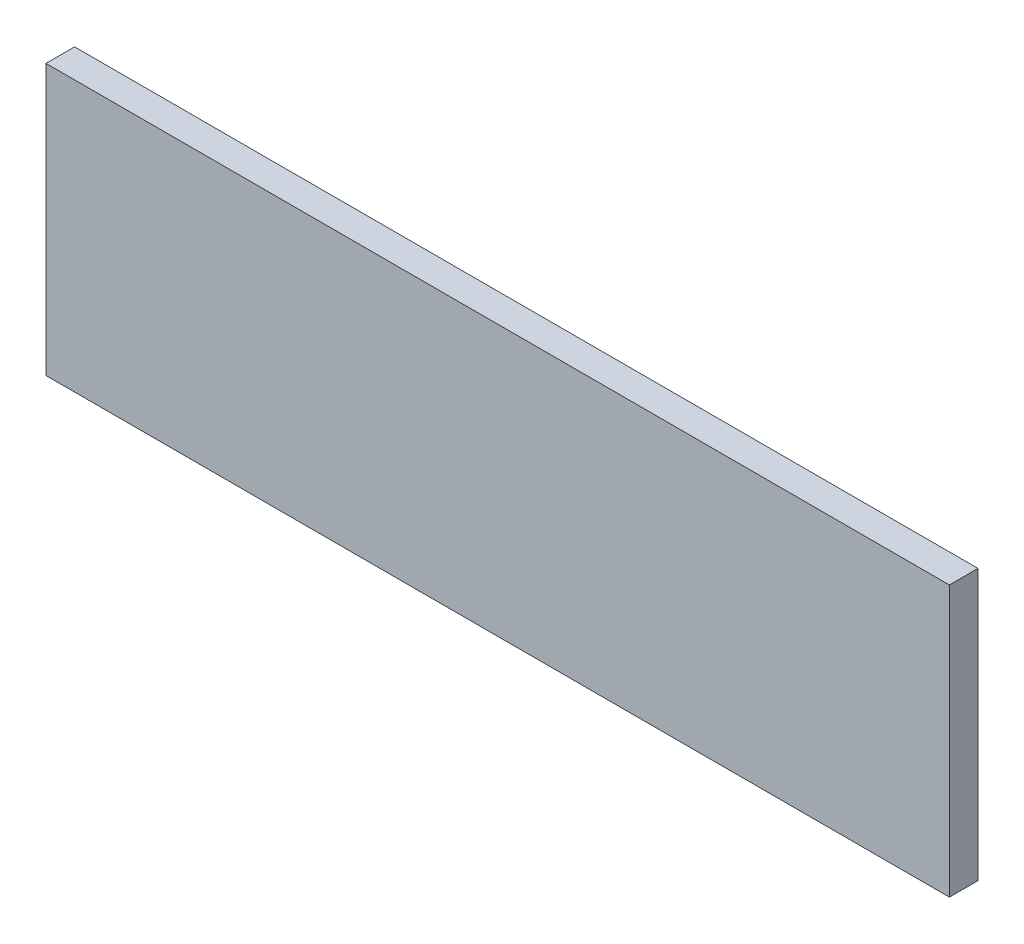
ISO-10303-21;
HEADER;
FILE_DESCRIPTION(('STEP AP214'),'2;1');
FILE_NAME('part.step','',(''),(''),'','','');
FILE_SCHEMA(('AUTOMOTIVE_DESIGN { 1 0 10303 214 1 1 1 1 }'));
ENDSEC;
DATA;
#1=APPLICATION_CONTEXT('core data for automotive mechanical design processes');
#2=APPLICATION_PROTOCOL_DEFINITION('international standard','automotive_design',2000,#1);
#3=PRODUCT_CONTEXT('',#1,'mechanical');
#4=PRODUCT('Part','Part','',(#3));
#5=PRODUCT_RELATED_PRODUCT_CATEGORY('part','',(#4));
#6=PRODUCT_DEFINITION_FORMATION('','',#4);
#7=PRODUCT_DEFINITION_CONTEXT('part definition',#1,'design');
#8=PRODUCT_DEFINITION('design','',#6,#7);
#9=PRODUCT_DEFINITION_SHAPE('','',#8);
#10=(LENGTH_UNIT() NAMED_UNIT(*) SI_UNIT(.MILLI.,.METRE.));
#11=(NAMED_UNIT(*) PLANE_ANGLE_UNIT() SI_UNIT($,.RADIAN.));
#12=(NAMED_UNIT(*) SI_UNIT($,.STERADIAN.) SOLID_ANGLE_UNIT());
#13=UNCERTAINTY_MEASURE_WITH_UNIT(LENGTH_MEASURE(1.E-05),#10,'distance_accuracy_value','');
#14=(GEOMETRIC_REPRESENTATION_CONTEXT(3) GLOBAL_UNCERTAINTY_ASSIGNED_CONTEXT((#13)) GLOBAL_UNIT_ASSIGNED_CONTEXT((#10,
#11,#12)) REPRESENTATION_CONTEXT('',''));
#15=CARTESIAN_POINT('',(0.,0.,0.));
#16=DIRECTION('',(0.,0.,1.));
#17=DIRECTION('',(1.,0.,0.));
#18=AXIS2_PLACEMENT_3D('',#15,#16,#17);
#19=CARTESIAN_POINT('',(50.1199999999999,15.,3.175));
#20=DIRECTION('',(-1.,0.,0.));
#21=DIRECTION('',(0.,-1.,0.));
#22=AXIS2_PLACEMENT_3D('',#19,#20,#21);
#23=PLANE('',#22);
#24=DIRECTION('',(0.,1.,0.));
#25=VECTOR('',#24,1.);
#26=CARTESIAN_POINT('',(50.1199999999999,15.,0.));
#27=LINE('',#26,#25);
#28=CARTESIAN_POINT('',(50.12,-15.,0.));
#29=VERTEX_POINT('',#28);
#30=CARTESIAN_POINT('',(50.1199999999999,15.,0.));
#31=VERTEX_POINT('',#30);
#32=EDGE_CURVE('E107',#29,#31,#27,.T.);
#33=ORIENTED_EDGE('',*,*,#32,.T.);
#34=DIRECTION('',(0.,0.,-1.));
#35=VECTOR('',#34,1.);
#36=CARTESIAN_POINT('',(50.1199999999999,15.,3.175));
#37=LINE('',#36,#35);
#38=CARTESIAN_POINT('',(50.1199999999999,15.,3.175));
#39=VERTEX_POINT('',#38);
#40=EDGE_CURVE('E11',#39,#31,#37,.T.);
#41=ORIENTED_EDGE('',*,*,#40,.F.);
#42=DIRECTION('',(0.,1.,0.));
#43=VECTOR('',#42,1.);
#44=CARTESIAN_POINT('',(50.1199999999999,15.,3.175));
#45=LINE('',#44,#43);
#46=CARTESIAN_POINT('',(50.12,-15.,3.175));
#47=VERTEX_POINT('',#46);
#48=EDGE_CURVE('E91',#47,#39,#45,.T.);
#49=ORIENTED_EDGE('',*,*,#48,.F.);
#50=DIRECTION('',(0.,0.,-1.));
#51=VECTOR('',#50,1.);
#52=CARTESIAN_POINT('',(50.12,-15.,3.175));
#53=LINE('',#52,#51);
#54=EDGE_CURVE('E103',#47,#29,#53,.T.);
#55=ORIENTED_EDGE('',*,*,#54,.T.);
#56=EDGE_LOOP('',(#33,#41,#49,#55));
#57=FACE_BOUND('',#56,.T.);
#58=ADVANCED_FACE('F39',(#57),#23,.F.);
#59=CARTESIAN_POINT('',(-50.12,15.,3.175));
#60=DIRECTION('',(0.,-1.,0.));
#61=DIRECTION('',(0.,0.,-1.));
#62=AXIS2_PLACEMENT_3D('',#59,#60,#61);
#63=PLANE('',#62);
#64=DIRECTION('',(-1.,0.,0.));
#65=VECTOR('',#64,1.);
#66=CARTESIAN_POINT('',(-50.12,15.,0.));
#67=LINE('',#66,#65);
#68=CARTESIAN_POINT('',(-50.12,15.,0.));
#69=VERTEX_POINT('',#68);
#70=EDGE_CURVE('E96',#31,#69,#67,.T.);
#71=ORIENTED_EDGE('',*,*,#70,.T.);
#72=DIRECTION('',(0.,0.,-1.));
#73=VECTOR('',#72,1.);
#74=CARTESIAN_POINT('',(-50.12,15.,3.175));
#75=LINE('',#74,#73);
#76=CARTESIAN_POINT('',(-50.12,15.,3.175));
#77=VERTEX_POINT('',#76);
#78=EDGE_CURVE('E48',#77,#69,#75,.T.);
#79=ORIENTED_EDGE('',*,*,#78,.F.);
#80=DIRECTION('',(-1.,0.,0.));
#81=VECTOR('',#80,1.);
#82=CARTESIAN_POINT('',(-50.12,15.,3.175));
#83=LINE('',#82,#81);
#84=EDGE_CURVE('E86',#39,#77,#83,.T.);
#85=ORIENTED_EDGE('',*,*,#84,.F.);
#86=ORIENTED_EDGE('',*,*,#40,.T.);
#87=EDGE_LOOP('',(#71,#79,#85,#86));
#88=FACE_BOUND('',#87,.T.);
#89=ADVANCED_FACE('F95',(#88),#63,.F.);
#90=CARTESIAN_POINT('',(-50.12,15.,3.175));
#91=DIRECTION('',(1.,0.,0.));
#92=DIRECTION('',(0.,1.,0.));
#93=AXIS2_PLACEMENT_3D('',#90,#91,#92);
#94=PLANE('',#93);
#95=DIRECTION('',(0.,-1.,0.));
#96=VECTOR('',#95,1.);
#97=CARTESIAN_POINT('',(-50.12,15.,0.));
#98=LINE('',#97,#96);
#99=CARTESIAN_POINT('',(-50.12,-15.,0.));
#100=VERTEX_POINT('',#99);
#101=EDGE_CURVE('E73',#69,#100,#98,.T.);
#102=ORIENTED_EDGE('',*,*,#101,.T.);
#103=DIRECTION('',(0.,0.,-1.));
#104=VECTOR('',#103,1.);
#105=CARTESIAN_POINT('',(-50.12,-15.,3.175));
#106=LINE('',#105,#104);
#107=CARTESIAN_POINT('',(-50.12,-15.,3.175));
#108=VERTEX_POINT('',#107);
#109=EDGE_CURVE('E98',#108,#100,#106,.T.);
#110=ORIENTED_EDGE('',*,*,#109,.F.);
#111=DIRECTION('',(0.,-1.,0.));
#112=VECTOR('',#111,1.);
#113=CARTESIAN_POINT('',(-50.12,15.,3.175));
#114=LINE('',#113,#112);
#115=EDGE_CURVE('E89',#77,#108,#114,.T.);
#116=ORIENTED_EDGE('',*,*,#115,.F.);
#117=ORIENTED_EDGE('',*,*,#78,.T.);
#118=EDGE_LOOP('',(#102,#110,#116,#117));
#119=FACE_BOUND('',#118,.T.);
#120=ADVANCED_FACE('F99',(#119),#94,.F.);
#121=CARTESIAN_POINT('',(-50.12,-15.,3.175));
#122=DIRECTION('',(0.,1.,0.));
#123=DIRECTION('',(0.,0.,1.));
#124=AXIS2_PLACEMENT_3D('',#121,#122,#123);
#125=PLANE('',#124);
#126=DIRECTION('',(1.,0.,0.));
#127=VECTOR('',#126,1.);
#128=CARTESIAN_POINT('',(-50.12,-15.,0.));
#129=LINE('',#128,#127);
#130=EDGE_CURVE('E79',#100,#29,#129,.T.);
#131=ORIENTED_EDGE('',*,*,#130,.T.);
#132=ORIENTED_EDGE('',*,*,#54,.F.);
#133=DIRECTION('',(1.,0.,0.));
#134=VECTOR('',#133,1.);
#135=CARTESIAN_POINT('',(-50.12,-15.,3.175));
#136=LINE('',#135,#134);
#137=EDGE_CURVE('E56',#108,#47,#136,.T.);
#138=ORIENTED_EDGE('',*,*,#137,.F.);
#139=ORIENTED_EDGE('',*,*,#109,.T.);
#140=EDGE_LOOP('',(#131,#132,#138,#139));
#141=FACE_BOUND('',#140,.T.);
#142=ADVANCED_FACE('F120',(#141),#125,.F.);
#143=CARTESIAN_POINT('',(0.,0.,3.175));
#144=DIRECTION('',(0.,0.,1.));
#145=DIRECTION('',(1.,0.,0.));
#146=AXIS2_PLACEMENT_3D('',#143,#144,#145);
#147=PLANE('',#146);
#148=ORIENTED_EDGE('',*,*,#48,.T.);
#149=ORIENTED_EDGE('',*,*,#84,.T.);
#150=ORIENTED_EDGE('',*,*,#115,.T.);
#151=ORIENTED_EDGE('',*,*,#137,.T.);
#152=EDGE_LOOP('',(#148,#149,#150,#151));
#153=FACE_BOUND('',#152,.T.);
#154=ADVANCED_FACE('F87',(#153),#147,.T.);
#155=CARTESIAN_POINT('',(0.,0.,0.));
#156=DIRECTION('',(0.,0.,1.));
#157=DIRECTION('',(1.,0.,0.));
#158=AXIS2_PLACEMENT_3D('',#155,#156,#157);
#159=PLANE('',#158);
#160=ORIENTED_EDGE('',*,*,#32,.F.);
#161=ORIENTED_EDGE('',*,*,#130,.F.);
#162=ORIENTED_EDGE('',*,*,#101,.F.);
#163=ORIENTED_EDGE('',*,*,#70,.F.);
#164=EDGE_LOOP('',(#160,#161,#162,#163));
#165=FACE_BOUND('',#164,.T.);
#166=ADVANCED_FACE('F123',(#165),#159,.F.);
#167=CLOSED_SHELL('',(#58,#89,#120,#142,#154,#166));
#168=MANIFOLD_SOLID_BREP('B2',#167);
#169=ADVANCED_BREP_SHAPE_REPRESENTATION('',(#18,#168),#14);
#170=SHAPE_DEFINITION_REPRESENTATION(#9,#169);
ENDSEC;
END-ISO-10303-21;
